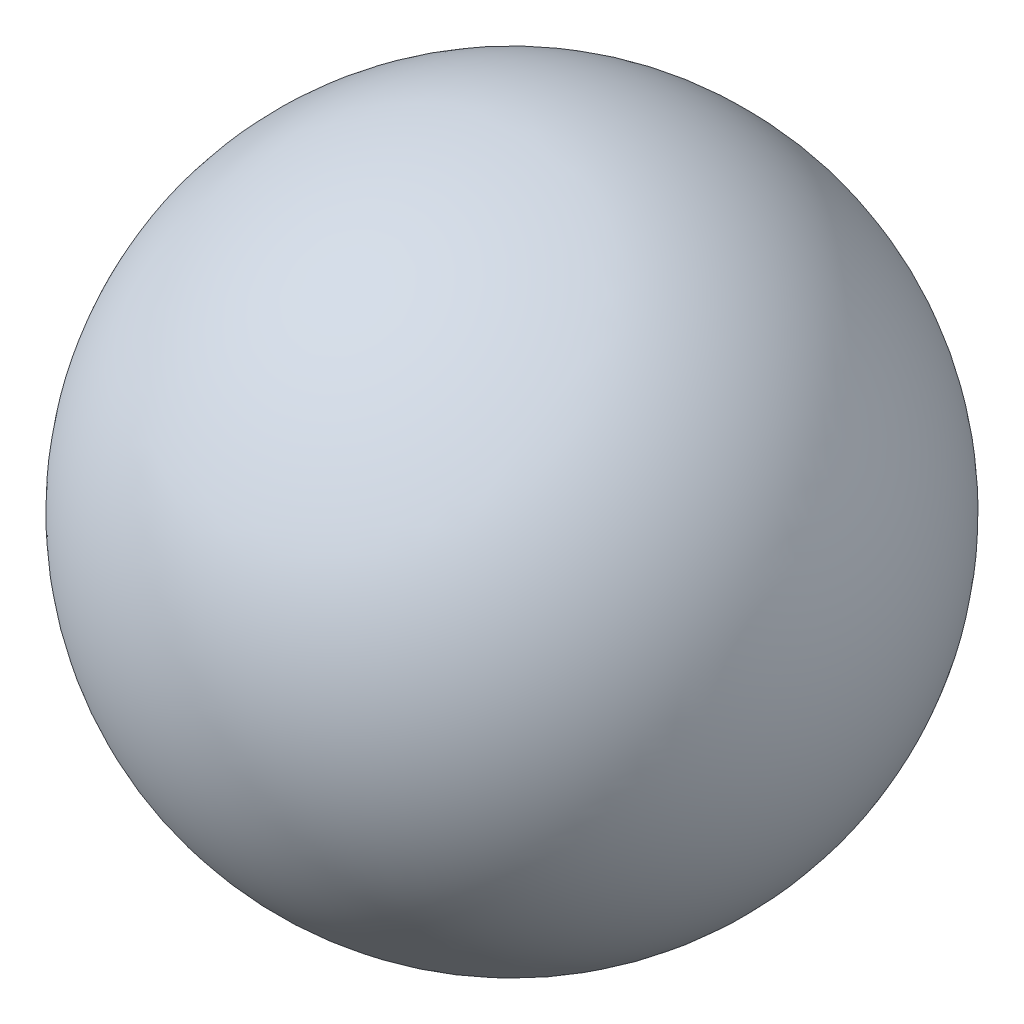
ISO-10303-21;
HEADER;
FILE_DESCRIPTION(('STEP AP214'),'2;1');
FILE_NAME('part.step','',(''),(''),'','','');
FILE_SCHEMA(('AUTOMOTIVE_DESIGN { 1 0 10303 214 1 1 1 1 }'));
ENDSEC;
DATA;
#1=APPLICATION_CONTEXT('core data for automotive mechanical design processes');
#2=APPLICATION_PROTOCOL_DEFINITION('international standard','automotive_design',2000,#1);
#3=PRODUCT_CONTEXT('',#1,'mechanical');
#4=PRODUCT('Part','Part','',(#3));
#5=PRODUCT_RELATED_PRODUCT_CATEGORY('part','',(#4));
#6=PRODUCT_DEFINITION_FORMATION('','',#4);
#7=PRODUCT_DEFINITION_CONTEXT('part definition',#1,'design');
#8=PRODUCT_DEFINITION('design','',#6,#7);
#9=PRODUCT_DEFINITION_SHAPE('','',#8);
#10=(LENGTH_UNIT() NAMED_UNIT(*) SI_UNIT(.MILLI.,.METRE.));
#11=(NAMED_UNIT(*) PLANE_ANGLE_UNIT() SI_UNIT($,.RADIAN.));
#12=(NAMED_UNIT(*) SI_UNIT($,.STERADIAN.) SOLID_ANGLE_UNIT());
#13=UNCERTAINTY_MEASURE_WITH_UNIT(LENGTH_MEASURE(1.E-05),#10,'distance_accuracy_value','');
#14=(GEOMETRIC_REPRESENTATION_CONTEXT(3) GLOBAL_UNCERTAINTY_ASSIGNED_CONTEXT((#13)) GLOBAL_UNIT_ASSIGNED_CONTEXT((#10,
#11,#12)) REPRESENTATION_CONTEXT('',''));
#15=CARTESIAN_POINT('',(0.,0.,0.));
#16=DIRECTION('',(0.,0.,1.));
#17=DIRECTION('',(1.,0.,0.));
#18=AXIS2_PLACEMENT_3D('',#15,#16,#17);
#19=CARTESIAN_POINT('',(0.,0.,0.));
#20=DIRECTION('',(-1.,0.,0.));
#21=DIRECTION('',(0.,1.,0.));
#22=AXIS2_PLACEMENT_3D('',#19,#20,#21);
#23=SPHERICAL_SURFACE('',#22,30.1156255529499);
#24=CARTESIAN_POINT('',(-30.1156255529499,0.,0.));
#25=VERTEX_POINT('',#24);
#26=VERTEX_LOOP('',#25);
#27=FACE_BOUND('',#26,.T.);
#28=ADVANCED_FACE('F29',(#27),#23,.T.);
#29=CLOSED_SHELL('',(#28));
#30=MANIFOLD_SOLID_BREP('B2',#29);
#31=ADVANCED_BREP_SHAPE_REPRESENTATION('',(#18,#30),#14);
#32=SHAPE_DEFINITION_REPRESENTATION(#9,#31);
ENDSEC;
END-ISO-10303-21;
